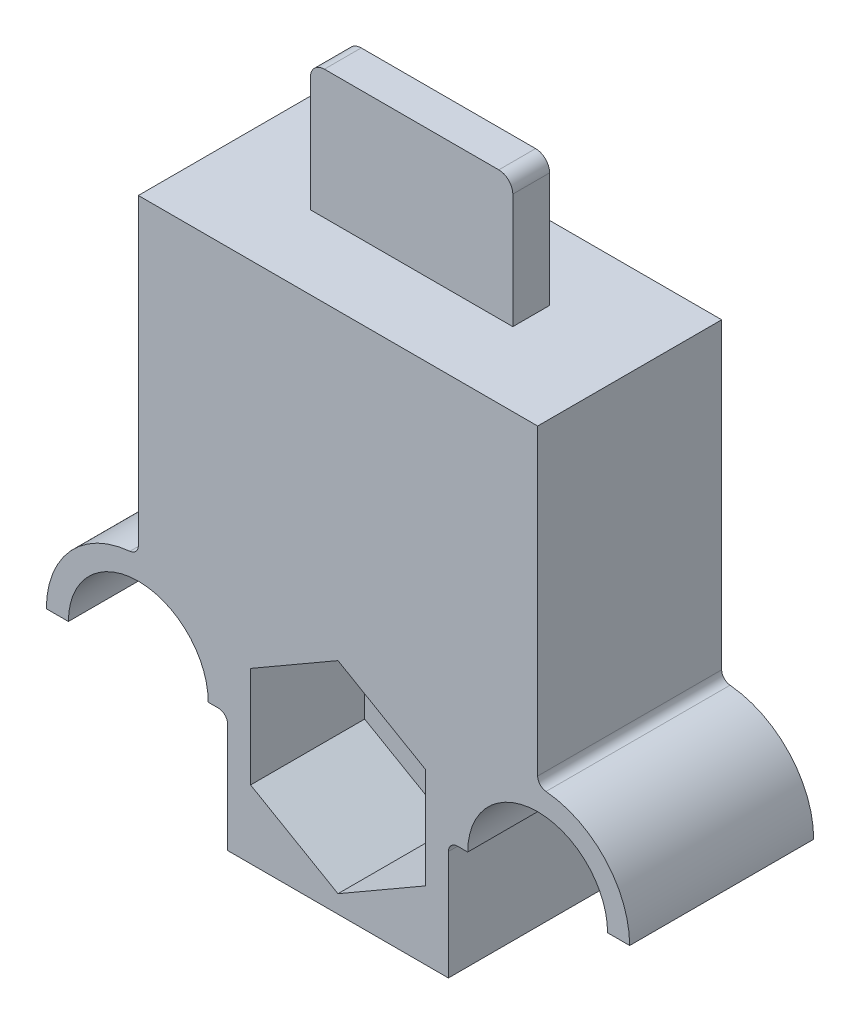
ISO-10303-21;
HEADER;
FILE_DESCRIPTION(('STEP AP214'),'2;1');
FILE_NAME('part.step','',(''),(''),'','','');
FILE_SCHEMA(('AUTOMOTIVE_DESIGN { 1 0 10303 214 1 1 1 1 }'));
ENDSEC;
DATA;
#1=APPLICATION_CONTEXT('core data for automotive mechanical design processes');
#2=APPLICATION_PROTOCOL_DEFINITION('international standard','automotive_design',2000,#1);
#3=PRODUCT_CONTEXT('',#1,'mechanical');
#4=PRODUCT('Part','Part','',(#3));
#5=PRODUCT_RELATED_PRODUCT_CATEGORY('part','',(#4));
#6=PRODUCT_DEFINITION_FORMATION('','',#4);
#7=PRODUCT_DEFINITION_CONTEXT('part definition',#1,'design');
#8=PRODUCT_DEFINITION('design','',#6,#7);
#9=PRODUCT_DEFINITION_SHAPE('','',#8);
#10=(LENGTH_UNIT() NAMED_UNIT(*) SI_UNIT(.MILLI.,.METRE.));
#11=(NAMED_UNIT(*) PLANE_ANGLE_UNIT() SI_UNIT($,.RADIAN.));
#12=(NAMED_UNIT(*) SI_UNIT($,.STERADIAN.) SOLID_ANGLE_UNIT());
#13=UNCERTAINTY_MEASURE_WITH_UNIT(LENGTH_MEASURE(1.E-05),#10,'distance_accuracy_value','');
#14=(GEOMETRIC_REPRESENTATION_CONTEXT(3) GLOBAL_UNCERTAINTY_ASSIGNED_CONTEXT((#13)) GLOBAL_UNIT_ASSIGNED_CONTEXT((#10,
#11,#12)) REPRESENTATION_CONTEXT('',''));
#15=CARTESIAN_POINT('',(0.,0.,0.));
#16=DIRECTION('',(0.,0.,1.));
#17=DIRECTION('',(1.,0.,0.));
#18=AXIS2_PLACEMENT_3D('',#15,#16,#17);
#19=CARTESIAN_POINT('',(9.15,1.95,-3828.45170901728));
#20=DIRECTION('',(0.,-1.,0.));
#21=DIRECTION('',(0.,0.,-1.));
#22=AXIS2_PLACEMENT_3D('',#19,#20,#21);
#23=PLANE('',#22);
#24=DIRECTION('',(-1.,0.,0.));
#25=VECTOR('',#24,1.);
#26=CARTESIAN_POINT('',(9.15,1.95,-3838.45170901728));
#27=LINE('',#26,#25);
#28=CARTESIAN_POINT('',(30.85,1.95,-3838.45170901728));
#29=VERTEX_POINT('',#28);
#30=CARTESIAN_POINT('',(9.15,1.95,-3838.45170901728));
#31=VERTEX_POINT('',#30);
#32=EDGE_CURVE('E362',#29,#31,#27,.T.);
#33=ORIENTED_EDGE('',*,*,#32,.T.);
#34=DIRECTION('',(0.,0.,-1.));
#35=VECTOR('',#34,1.);
#36=CARTESIAN_POINT('',(9.15,1.95,-3828.45170901728));
#37=LINE('',#36,#35);
#38=CARTESIAN_POINT('',(9.15,1.95,-3828.45170901728));
#39=VERTEX_POINT('',#38);
#40=EDGE_CURVE('E440',#39,#31,#37,.T.);
#41=ORIENTED_EDGE('',*,*,#40,.F.);
#42=DIRECTION('',(-1.,0.,0.));
#43=VECTOR('',#42,1.);
#44=CARTESIAN_POINT('',(9.15,1.95,-3828.45170901728));
#45=LINE('',#44,#43);
#46=CARTESIAN_POINT('',(30.85,1.95,-3828.45170901728));
#47=VERTEX_POINT('',#46);
#48=EDGE_CURVE('E322',#47,#39,#45,.T.);
#49=ORIENTED_EDGE('',*,*,#48,.F.);
#50=DIRECTION('',(0.,0.,-1.));
#51=VECTOR('',#50,1.);
#52=CARTESIAN_POINT('',(30.85,1.95,-3828.45170901728));
#53=LINE('',#52,#51);
#54=EDGE_CURVE('E438',#47,#29,#53,.T.);
#55=ORIENTED_EDGE('',*,*,#54,.T.);
#56=EDGE_LOOP('',(#33,#41,#49,#55));
#57=FACE_BOUND('',#56,.T.);
#58=DIRECTION('',(0.,0.,-1.));
#59=VECTOR('',#58,1.);
#60=CARTESIAN_POINT('',(25.5,1.95,-3832.45170901728));
#61=LINE('',#60,#59);
#62=CARTESIAN_POINT('',(25.5,1.95,-3832.45170901728));
#63=VERTEX_POINT('',#62);
#64=CARTESIAN_POINT('',(25.5,1.95,-3834.45170901728));
#65=VERTEX_POINT('',#64);
#66=EDGE_CURVE('E252',#63,#65,#61,.T.);
#67=ORIENTED_EDGE('',*,*,#66,.F.);
#68=DIRECTION('',(1.,0.,0.));
#69=VECTOR('',#68,1.);
#70=CARTESIAN_POINT('',(25.5,1.95,-3832.45170901728));
#71=LINE('',#70,#69);
#72=CARTESIAN_POINT('',(14.5,1.95,-3832.45170901728));
#73=VERTEX_POINT('',#72);
#74=EDGE_CURVE('E249',#73,#63,#71,.T.);
#75=ORIENTED_EDGE('',*,*,#74,.F.);
#76=DIRECTION('',(0.,0.,1.));
#77=VECTOR('',#76,1.);
#78=CARTESIAN_POINT('',(14.5,1.95,-3832.45170901728));
#79=LINE('',#78,#77);
#80=CARTESIAN_POINT('',(14.5,1.95,-3834.45170901728));
#81=VERTEX_POINT('',#80);
#82=EDGE_CURVE('E240',#81,#73,#79,.T.);
#83=ORIENTED_EDGE('',*,*,#82,.F.);
#84=DIRECTION('',(-1.,0.,0.));
#85=VECTOR('',#84,1.);
#86=CARTESIAN_POINT('',(25.5,1.95,-3834.45170901728));
#87=LINE('',#86,#85);
#88=EDGE_CURVE('E250',#65,#81,#87,.T.);
#89=ORIENTED_EDGE('',*,*,#88,.F.);
#90=EDGE_LOOP('',(#67,#75,#83,#89));
#91=FACE_BOUND('',#90,.T.);
#92=ADVANCED_FACE('F39',(#57,#91),#23,.F.);
#93=CARTESIAN_POINT('',(20.,-20.,-3828.45170901728));
#94=DIRECTION('',(0.,0.,-1.));
#95=DIRECTION('',(-1.,0.,0.));
#96=AXIS2_PLACEMENT_3D('',#93,#94,#95);
#97=CYLINDRICAL_SURFACE('',#96,2.5);
#98=CARTESIAN_POINT('',(20.,-20.,-3838.45170901728));
#99=DIRECTION('',(0.,0.,1.));
#100=DIRECTION('',(1.,0.,0.));
#101=AXIS2_PLACEMENT_3D('',#98,#99,#100);
#102=CIRCLE('',#101,2.5);
#103=CARTESIAN_POINT('',(22.5,-20.,-3838.45170901728));
#104=VERTEX_POINT('',#103);
#105=EDGE_CURVE('E311',#104,#104,#102,.T.);
#106=ORIENTED_EDGE('',*,*,#105,.F.);
#107=EDGE_LOOP('',(#106));
#108=FACE_BOUND('',#107,.T.);
#109=CARTESIAN_POINT('',(20.,-20.,-3834.65170901728));
#110=DIRECTION('',(0.,0.,1.));
#111=DIRECTION('',(1.,0.,0.));
#112=AXIS2_PLACEMENT_3D('',#109,#110,#111);
#113=CIRCLE('',#112,2.5);
#114=CARTESIAN_POINT('',(22.5,-20.,-3834.65170901728));
#115=VERTEX_POINT('',#114);
#116=EDGE_CURVE('E302',#115,#115,#113,.T.);
#117=ORIENTED_EDGE('',*,*,#116,.T.);
#118=EDGE_LOOP('',(#117));
#119=FACE_BOUND('',#118,.T.);
#120=ADVANCED_FACE('F489',(#108,#119),#97,.F.);
#121=CARTESIAN_POINT('',(31.35,-14.5227744249483,-3828.45170901728));
#122=DIRECTION('',(0.,0.,-1.));
#123=DIRECTION('',(-1.,0.,0.));
#124=AXIS2_PLACEMENT_3D('',#121,#122,#123);
#125=PLANE('',#124);
#126=DIRECTION('',(0.866025403784439,0.5,0.));
#127=VECTOR('',#126,1.);
#128=CARTESIAN_POINT('',(20.,-25.4848275573014,-3828.45170901728));
#129=LINE('',#128,#127);
#130=CARTESIAN_POINT('',(20.,-25.4848275573014,-3828.45170901728));
#131=VERTEX_POINT('',#130);
#132=CARTESIAN_POINT('',(24.75,-22.7424137786507,-3828.45170901728));
#133=VERTEX_POINT('',#132);
#134=EDGE_CURVE('E290',#131,#133,#129,.T.);
#135=ORIENTED_EDGE('',*,*,#134,.F.);
#136=DIRECTION('',(0.866025403784439,-0.5,0.));
#137=VECTOR('',#136,1.);
#138=CARTESIAN_POINT('',(15.25,-22.7424137786507,-3828.45170901728));
#139=LINE('',#138,#137);
#140=CARTESIAN_POINT('',(15.25,-22.7424137786507,-3828.45170901728));
#141=VERTEX_POINT('',#140);
#142=EDGE_CURVE('E262',#141,#131,#139,.T.);
#143=ORIENTED_EDGE('',*,*,#142,.F.);
#144=DIRECTION('',(0.,-1.,0.));
#145=VECTOR('',#144,1.);
#146=CARTESIAN_POINT('',(15.25,-17.2575862213493,-3828.45170901728));
#147=LINE('',#146,#145);
#148=CARTESIAN_POINT('',(15.25,-17.2575862213493,-3828.45170901728));
#149=VERTEX_POINT('',#148);
#150=EDGE_CURVE('E269',#149,#141,#147,.T.);
#151=ORIENTED_EDGE('',*,*,#150,.F.);
#152=DIRECTION('',(-0.866025403784439,-0.5,0.));
#153=VECTOR('',#152,1.);
#154=CARTESIAN_POINT('',(20.,-14.5151724426986,-3828.45170901728));
#155=LINE('',#154,#153);
#156=CARTESIAN_POINT('',(20.,-14.5151724426986,-3828.45170901728));
#157=VERTEX_POINT('',#156);
#158=EDGE_CURVE('E298',#157,#149,#155,.T.);
#159=ORIENTED_EDGE('',*,*,#158,.F.);
#160=DIRECTION('',(-0.866025403784439,0.5,0.));
#161=VECTOR('',#160,1.);
#162=CARTESIAN_POINT('',(24.75,-17.2575862213493,-3828.45170901728));
#163=LINE('',#162,#161);
#164=CARTESIAN_POINT('',(24.75,-17.2575862213493,-3828.45170901728));
#165=VERTEX_POINT('',#164);
#166=EDGE_CURVE('E292',#165,#157,#163,.T.);
#167=ORIENTED_EDGE('',*,*,#166,.F.);
#168=DIRECTION('',(0.,1.,0.));
#169=VECTOR('',#168,1.);
#170=CARTESIAN_POINT('',(24.75,-22.7424137786507,-3828.45170901728));
#171=LINE('',#170,#169);
#172=EDGE_CURVE('E288',#133,#165,#171,.T.);
#173=ORIENTED_EDGE('',*,*,#172,.F.);
#174=EDGE_LOOP('',(#135,#143,#151,#159,#167,#173));
#175=FACE_BOUND('',#174,.T.);
#176=CARTESIAN_POINT('',(31.35,-14.5227744249483,-3828.45170901728));
#177=DIRECTION('',(0.,0.,-1.));
#178=DIRECTION('',(-1.,0.,0.));
#179=AXIS2_PLACEMENT_3D('',#176,#177,#178);
#180=CIRCLE('',#179,0.499999999999999);
#181=CARTESIAN_POINT('',(31.3045454545455,-15.0207040226803,-3828.45170901728));
#182=VERTEX_POINT('',#181);
#183=CARTESIAN_POINT('',(30.85,-14.5227744249483,-3828.45170901728));
#184=VERTEX_POINT('',#183);
#185=EDGE_CURVE('E317',#182,#184,#180,.T.);
#186=ORIENTED_EDGE('',*,*,#185,.T.);
#187=DIRECTION('',(0.,1.,0.));
#188=VECTOR('',#187,1.);
#189=CARTESIAN_POINT('',(30.85,1.95,-3828.45170901728));
#190=LINE('',#189,#188);
#191=EDGE_CURVE('E323',#184,#47,#190,.T.);
#192=ORIENTED_EDGE('',*,*,#191,.T.);
#193=ORIENTED_EDGE('',*,*,#48,.T.);
#194=DIRECTION('',(0.,-1.,0.));
#195=VECTOR('',#194,1.);
#196=CARTESIAN_POINT('',(9.15,-14.5227744249483,-3828.45170901728));
#197=LINE('',#196,#195);
#198=CARTESIAN_POINT('',(9.15,-14.5227744249483,-3828.45170901728));
#199=VERTEX_POINT('',#198);
#200=EDGE_CURVE('E328',#39,#199,#197,.T.);
#201=ORIENTED_EDGE('',*,*,#200,.T.);
#202=CARTESIAN_POINT('',(8.65,-14.5227744249483,-3828.45170901728));
#203=DIRECTION('',(0.,0.,-1.));
#204=DIRECTION('',(1.,0.,0.));
#205=AXIS2_PLACEMENT_3D('',#202,#203,#204);
#206=CIRCLE('',#205,0.5);
#207=CARTESIAN_POINT('',(8.69545454545454,-15.0207040226803,-3828.45170901728));
#208=VERTEX_POINT('',#207);
#209=EDGE_CURVE('E327',#199,#208,#206,.T.);
#210=ORIENTED_EDGE('',*,*,#209,.T.);
#211=CARTESIAN_POINT('',(9.15,-20.,-3828.45170901728));
#212=DIRECTION('',(0.,0.,1.));
#213=DIRECTION('',(1.,0.,0.));
#214=AXIS2_PLACEMENT_3D('',#211,#212,#213);
#215=CIRCLE('',#214,5.);
#216=CARTESIAN_POINT('',(4.15,-20.,-3828.45170901728));
#217=VERTEX_POINT('',#216);
#218=EDGE_CURVE('E326',#208,#217,#215,.T.);
#219=ORIENTED_EDGE('',*,*,#218,.T.);
#220=DIRECTION('',(1.,0.,0.));
#221=VECTOR('',#220,1.);
#222=CARTESIAN_POINT('',(5.35,-20.,-3828.45170901728));
#223=LINE('',#222,#221);
#224=CARTESIAN_POINT('',(5.35,-20.,-3828.45170901728));
#225=VERTEX_POINT('',#224);
#226=EDGE_CURVE('E332',#217,#225,#223,.T.);
#227=ORIENTED_EDGE('',*,*,#226,.T.);
#228=CARTESIAN_POINT('',(9.15,-20.,-3828.45170901728));
#229=DIRECTION('',(0.,0.,-1.));
#230=DIRECTION('',(1.,0.,0.));
#231=AXIS2_PLACEMENT_3D('',#228,#229,#230);
#232=CIRCLE('',#231,3.8);
#233=CARTESIAN_POINT('',(12.95,-20.,-3828.45170901728));
#234=VERTEX_POINT('',#233);
#235=EDGE_CURVE('E335',#225,#234,#232,.T.);
#236=ORIENTED_EDGE('',*,*,#235,.T.);
#237=DIRECTION('',(1.,0.,0.));
#238=VECTOR('',#237,1.);
#239=CARTESIAN_POINT('',(13.5,-20.,-3828.45170901728));
#240=LINE('',#239,#238);
#241=CARTESIAN_POINT('',(13.5,-20.,-3828.45170901728));
#242=VERTEX_POINT('',#241);
#243=EDGE_CURVE('E338',#234,#242,#240,.T.);
#244=ORIENTED_EDGE('',*,*,#243,.T.);
#245=CARTESIAN_POINT('',(13.5,-20.5,-3828.45170901728));
#246=DIRECTION('',(0.,0.,-1.));
#247=DIRECTION('',(-1.,0.,0.));
#248=AXIS2_PLACEMENT_3D('',#245,#246,#247);
#249=CIRCLE('',#248,0.5);
#250=CARTESIAN_POINT('',(14.,-20.5,-3828.45170901728));
#251=VERTEX_POINT('',#250);
#252=EDGE_CURVE('E336',#242,#251,#249,.T.);
#253=ORIENTED_EDGE('',*,*,#252,.T.);
#254=DIRECTION('',(0.,-1.,0.));
#255=VECTOR('',#254,1.);
#256=CARTESIAN_POINT('',(14.,-26.4525430578741,-3828.45170901728));
#257=LINE('',#256,#255);
#258=CARTESIAN_POINT('',(14.,-26.4525430578741,-3828.45170901728));
#259=VERTEX_POINT('',#258);
#260=EDGE_CURVE('E337',#251,#259,#257,.T.);
#261=ORIENTED_EDGE('',*,*,#260,.T.);
#262=DIRECTION('',(1.,0.,0.));
#263=VECTOR('',#262,1.);
#264=CARTESIAN_POINT('',(20.,-26.4525430578741,-3828.45170901728));
#265=LINE('',#264,#263);
#266=CARTESIAN_POINT('',(26.,-26.4525430578741,-3828.45170901728));
#267=VERTEX_POINT('',#266);
#268=EDGE_CURVE('E345',#259,#267,#265,.T.);
#269=ORIENTED_EDGE('',*,*,#268,.T.);
#270=DIRECTION('',(0.,1.,0.));
#271=VECTOR('',#270,1.);
#272=CARTESIAN_POINT('',(26.,-26.4525430578741,-3828.45170901728));
#273=LINE('',#272,#271);
#274=CARTESIAN_POINT('',(26.,-20.5,-3828.45170901728));
#275=VERTEX_POINT('',#274);
#276=EDGE_CURVE('E342',#267,#275,#273,.T.);
#277=ORIENTED_EDGE('',*,*,#276,.T.);
#278=CARTESIAN_POINT('',(26.5,-20.5,-3828.45170901728));
#279=DIRECTION('',(0.,0.,-1.));
#280=DIRECTION('',(1.,0.,0.));
#281=AXIS2_PLACEMENT_3D('',#278,#279,#280);
#282=CIRCLE('',#281,0.5);
#283=CARTESIAN_POINT('',(26.5,-20.,-3828.45170901728));
#284=VERTEX_POINT('',#283);
#285=EDGE_CURVE('E346',#275,#284,#282,.T.);
#286=ORIENTED_EDGE('',*,*,#285,.T.);
#287=DIRECTION('',(1.,0.,0.));
#288=VECTOR('',#287,1.);
#289=CARTESIAN_POINT('',(27.05,-20.,-3828.45170901728));
#290=LINE('',#289,#288);
#291=CARTESIAN_POINT('',(27.05,-20.,-3828.45170901728));
#292=VERTEX_POINT('',#291);
#293=EDGE_CURVE('E348',#284,#292,#290,.T.);
#294=ORIENTED_EDGE('',*,*,#293,.T.);
#295=CARTESIAN_POINT('',(30.85,-20.,-3828.45170901728));
#296=DIRECTION('',(0.,0.,-1.));
#297=DIRECTION('',(1.,0.,0.));
#298=AXIS2_PLACEMENT_3D('',#295,#296,#297);
#299=CIRCLE('',#298,3.8);
#300=CARTESIAN_POINT('',(34.65,-20.,-3828.45170901728));
#301=VERTEX_POINT('',#300);
#302=EDGE_CURVE('E349',#292,#301,#299,.T.);
#303=ORIENTED_EDGE('',*,*,#302,.T.);
#304=DIRECTION('',(1.,0.,0.));
#305=VECTOR('',#304,1.);
#306=CARTESIAN_POINT('',(34.65,-20.,-3828.45170901728));
#307=LINE('',#306,#305);
#308=CARTESIAN_POINT('',(35.85,-20.,-3828.45170901728));
#309=VERTEX_POINT('',#308);
#310=EDGE_CURVE('E355',#301,#309,#307,.T.);
#311=ORIENTED_EDGE('',*,*,#310,.T.);
#312=CARTESIAN_POINT('',(30.85,-20.,-3828.45170901728));
#313=DIRECTION('',(0.,0.,1.));
#314=DIRECTION('',(1.,0.,0.));
#315=AXIS2_PLACEMENT_3D('',#312,#313,#314);
#316=CIRCLE('',#315,5.);
#317=EDGE_CURVE('E353',#309,#182,#316,.T.);
#318=ORIENTED_EDGE('',*,*,#317,.T.);
#319=EDGE_LOOP('',(#186,#192,#193,#201,#210,#219,#227,#236,#244,#253,#261,#269,#277,#286,#294,
#303,#311,#318));
#320=FACE_BOUND('',#319,.T.);
#321=ADVANCED_FACE('F494',(#175,#320),#125,.F.);
#322=CARTESIAN_POINT('',(31.35,-14.5227744249483,-3838.45170901728));
#323=DIRECTION('',(0.,0.,-1.));
#324=DIRECTION('',(-1.,0.,0.));
#325=AXIS2_PLACEMENT_3D('',#322,#323,#324);
#326=PLANE('',#325);
#327=CARTESIAN_POINT('',(31.35,-14.5227744249483,-3838.45170901728));
#328=DIRECTION('',(0.,0.,-1.));
#329=DIRECTION('',(-1.,0.,0.));
#330=AXIS2_PLACEMENT_3D('',#327,#328,#329);
#331=CIRCLE('',#330,0.499999999999999);
#332=CARTESIAN_POINT('',(31.3045454545455,-15.0207040226803,-3838.45170901728));
#333=VERTEX_POINT('',#332);
#334=CARTESIAN_POINT('',(30.85,-14.5227744249483,-3838.45170901728));
#335=VERTEX_POINT('',#334);
#336=EDGE_CURVE('E320',#333,#335,#331,.T.);
#337=ORIENTED_EDGE('',*,*,#336,.F.);
#338=CARTESIAN_POINT('',(30.85,-20.,-3838.45170901728));
#339=DIRECTION('',(0.,0.,1.));
#340=DIRECTION('',(1.,0.,0.));
#341=AXIS2_PLACEMENT_3D('',#338,#339,#340);
#342=CIRCLE('',#341,5.);
#343=CARTESIAN_POINT('',(35.85,-20.,-3838.45170901728));
#344=VERTEX_POINT('',#343);
#345=EDGE_CURVE('E325',#344,#333,#342,.T.);
#346=ORIENTED_EDGE('',*,*,#345,.F.);
#347=DIRECTION('',(1.,0.,0.));
#348=VECTOR('',#347,1.);
#349=CARTESIAN_POINT('',(34.65,-20.,-3838.45170901728));
#350=LINE('',#349,#348);
#351=CARTESIAN_POINT('',(34.65,-20.,-3838.45170901728));
#352=VERTEX_POINT('',#351);
#353=EDGE_CURVE('E388',#352,#344,#350,.T.);
#354=ORIENTED_EDGE('',*,*,#353,.F.);
#355=CARTESIAN_POINT('',(30.85,-20.,-3838.45170901728));
#356=DIRECTION('',(0.,0.,-1.));
#357=DIRECTION('',(1.,0.,0.));
#358=AXIS2_PLACEMENT_3D('',#355,#356,#357);
#359=CIRCLE('',#358,3.8);
#360=CARTESIAN_POINT('',(27.05,-20.,-3838.45170901728));
#361=VERTEX_POINT('',#360);
#362=EDGE_CURVE('E389',#361,#352,#359,.T.);
#363=ORIENTED_EDGE('',*,*,#362,.F.);
#364=DIRECTION('',(1.,0.,0.));
#365=VECTOR('',#364,1.);
#366=CARTESIAN_POINT('',(27.05,-20.,-3838.45170901728));
#367=LINE('',#366,#365);
#368=CARTESIAN_POINT('',(26.5,-20.,-3838.45170901728));
#369=VERTEX_POINT('',#368);
#370=EDGE_CURVE('E387',#369,#361,#367,.T.);
#371=ORIENTED_EDGE('',*,*,#370,.F.);
#372=CARTESIAN_POINT('',(26.5,-20.5,-3838.45170901728));
#373=DIRECTION('',(0.,0.,-1.));
#374=DIRECTION('',(1.,0.,0.));
#375=AXIS2_PLACEMENT_3D('',#372,#373,#374);
#376=CIRCLE('',#375,0.5);
#377=CARTESIAN_POINT('',(26.,-20.5,-3838.45170901728));
#378=VERTEX_POINT('',#377);
#379=EDGE_CURVE('E384',#378,#369,#376,.T.);
#380=ORIENTED_EDGE('',*,*,#379,.F.);
#381=DIRECTION('',(0.,1.,0.));
#382=VECTOR('',#381,1.);
#383=CARTESIAN_POINT('',(26.,-26.4525430578741,-3838.45170901728));
#384=LINE('',#383,#382);
#385=CARTESIAN_POINT('',(26.,-26.4525430578741,-3838.45170901728));
#386=VERTEX_POINT('',#385);
#387=EDGE_CURVE('E385',#386,#378,#384,.T.);
#388=ORIENTED_EDGE('',*,*,#387,.F.);
#389=DIRECTION('',(1.,0.,0.));
#390=VECTOR('',#389,1.);
#391=CARTESIAN_POINT('',(20.,-26.4525430578741,-3838.45170901728));
#392=LINE('',#391,#390);
#393=CARTESIAN_POINT('',(14.,-26.4525430578741,-3838.45170901728));
#394=VERTEX_POINT('',#393);
#395=EDGE_CURVE('E376',#394,#386,#392,.T.);
#396=ORIENTED_EDGE('',*,*,#395,.F.);
#397=DIRECTION('',(0.,-1.,0.));
#398=VECTOR('',#397,1.);
#399=CARTESIAN_POINT('',(14.,-26.4525430578741,-3838.45170901728));
#400=LINE('',#399,#398);
#401=CARTESIAN_POINT('',(14.,-20.5,-3838.45170901728));
#402=VERTEX_POINT('',#401);
#403=EDGE_CURVE('E379',#402,#394,#400,.T.);
#404=ORIENTED_EDGE('',*,*,#403,.F.);
#405=CARTESIAN_POINT('',(13.5,-20.5,-3838.45170901728));
#406=DIRECTION('',(0.,0.,-1.));
#407=DIRECTION('',(-1.,0.,0.));
#408=AXIS2_PLACEMENT_3D('',#405,#406,#407);
#409=CIRCLE('',#408,0.5);
#410=CARTESIAN_POINT('',(13.5,-20.,-3838.45170901728));
#411=VERTEX_POINT('',#410);
#412=EDGE_CURVE('E374',#411,#402,#409,.T.);
#413=ORIENTED_EDGE('',*,*,#412,.F.);
#414=DIRECTION('',(1.,0.,0.));
#415=VECTOR('',#414,1.);
#416=CARTESIAN_POINT('',(13.5,-20.,-3838.45170901728));
#417=LINE('',#416,#415);
#418=CARTESIAN_POINT('',(12.95,-20.,-3838.45170901728));
#419=VERTEX_POINT('',#418);
#420=EDGE_CURVE('E371',#419,#411,#417,.T.);
#421=ORIENTED_EDGE('',*,*,#420,.F.);
#422=CARTESIAN_POINT('',(9.15,-20.,-3838.45170901728));
#423=DIRECTION('',(0.,0.,-1.));
#424=DIRECTION('',(1.,0.,0.));
#425=AXIS2_PLACEMENT_3D('',#422,#423,#424);
#426=CIRCLE('',#425,3.8);
#427=CARTESIAN_POINT('',(5.35,-20.,-3838.45170901728));
#428=VERTEX_POINT('',#427);
#429=EDGE_CURVE('E373',#428,#419,#426,.T.);
#430=ORIENTED_EDGE('',*,*,#429,.F.);
#431=DIRECTION('',(1.,0.,0.));
#432=VECTOR('',#431,1.);
#433=CARTESIAN_POINT('',(5.35,-20.,-3838.45170901728));
#434=LINE('',#433,#432);
#435=CARTESIAN_POINT('',(4.15,-20.,-3838.45170901728));
#436=VERTEX_POINT('',#435);
#437=EDGE_CURVE('E368',#436,#428,#434,.T.);
#438=ORIENTED_EDGE('',*,*,#437,.F.);
#439=CARTESIAN_POINT('',(9.15,-20.,-3838.45170901728));
#440=DIRECTION('',(0.,0.,1.));
#441=DIRECTION('',(1.,0.,0.));
#442=AXIS2_PLACEMENT_3D('',#439,#440,#441);
#443=CIRCLE('',#442,5.);
#444=CARTESIAN_POINT('',(8.69545454545454,-15.0207040226803,-3838.45170901728));
#445=VERTEX_POINT('',#444);
#446=EDGE_CURVE('E370',#445,#436,#443,.T.);
#447=ORIENTED_EDGE('',*,*,#446,.F.);
#448=CARTESIAN_POINT('',(8.65,-14.5227744249483,-3838.45170901728));
#449=DIRECTION('',(0.,0.,-1.));
#450=DIRECTION('',(1.,0.,0.));
#451=AXIS2_PLACEMENT_3D('',#448,#449,#450);
#452=CIRCLE('',#451,0.5);
#453=CARTESIAN_POINT('',(9.15,-14.5227744249483,-3838.45170901728));
#454=VERTEX_POINT('',#453);
#455=EDGE_CURVE('E363',#454,#445,#452,.T.);
#456=ORIENTED_EDGE('',*,*,#455,.F.);
#457=DIRECTION('',(0.,-1.,0.));
#458=VECTOR('',#457,1.);
#459=CARTESIAN_POINT('',(9.15,-14.5227744249483,-3838.45170901728));
#460=LINE('',#459,#458);
#461=EDGE_CURVE('E364',#31,#454,#460,.T.);
#462=ORIENTED_EDGE('',*,*,#461,.F.);
#463=ORIENTED_EDGE('',*,*,#32,.F.);
#464=DIRECTION('',(0.,1.,0.));
#465=VECTOR('',#464,1.);
#466=CARTESIAN_POINT('',(30.85,1.95,-3838.45170901728));
#467=LINE('',#466,#465);
#468=EDGE_CURVE('E356',#335,#29,#467,.T.);
#469=ORIENTED_EDGE('',*,*,#468,.F.);
#470=EDGE_LOOP('',(#337,#346,#354,#363,#371,#380,#388,#396,#404,#413,#421,#430,#438,#447,#456,
#462,#463,#469));
#471=FACE_BOUND('',#470,.T.);
#472=ORIENTED_EDGE('',*,*,#105,.T.);
#473=EDGE_LOOP('',(#472));
#474=FACE_BOUND('',#473,.T.);
#475=ADVANCED_FACE('F509',(#471,#474),#326,.T.);
#476=CARTESIAN_POINT('',(31.35,-14.5227744249483,-3828.45170901728));
#477=DIRECTION('',(0.,0.,-1.));
#478=DIRECTION('',(-1.,0.,0.));
#479=AXIS2_PLACEMENT_3D('',#476,#477,#478);
#480=CYLINDRICAL_SURFACE('',#479,0.499999999999999);
#481=ORIENTED_EDGE('',*,*,#336,.T.);
#482=DIRECTION('',(0.,0.,-1.));
#483=VECTOR('',#482,1.);
#484=CARTESIAN_POINT('',(30.85,-14.5227744249483,-3828.45170901728));
#485=LINE('',#484,#483);
#486=EDGE_CURVE('E442',#184,#335,#485,.T.);
#487=ORIENTED_EDGE('',*,*,#486,.F.);
#488=ORIENTED_EDGE('',*,*,#185,.F.);
#489=DIRECTION('',(0.,0.,-1.));
#490=VECTOR('',#489,1.);
#491=CARTESIAN_POINT('',(31.3045454545455,-15.0207040226803,-3828.45170901728));
#492=LINE('',#491,#490);
#493=EDGE_CURVE('E357',#182,#333,#492,.T.);
#494=ORIENTED_EDGE('',*,*,#493,.T.);
#495=EDGE_LOOP('',(#481,#487,#488,#494));
#496=FACE_BOUND('',#495,.T.);
#497=ADVANCED_FACE('F504',(#496),#480,.F.);
#498=CARTESIAN_POINT('',(30.85,1.95,-3828.45170901728));
#499=DIRECTION('',(-1.,0.,0.));
#500=DIRECTION('',(0.,-1.,0.));
#501=AXIS2_PLACEMENT_3D('',#498,#499,#500);
#502=PLANE('',#501);
#503=ORIENTED_EDGE('',*,*,#468,.T.);
#504=ORIENTED_EDGE('',*,*,#54,.F.);
#505=ORIENTED_EDGE('',*,*,#191,.F.);
#506=ORIENTED_EDGE('',*,*,#486,.T.);
#507=EDGE_LOOP('',(#503,#504,#505,#506));
#508=FACE_BOUND('',#507,.T.);
#509=ADVANCED_FACE('F505',(#508),#502,.F.);
#510=CARTESIAN_POINT('',(9.15,-14.5227744249483,-3828.45170901728));
#511=DIRECTION('',(1.,0.,0.));
#512=DIRECTION('',(0.,1.,0.));
#513=AXIS2_PLACEMENT_3D('',#510,#511,#512);
#514=PLANE('',#513);
#515=ORIENTED_EDGE('',*,*,#461,.T.);
#516=DIRECTION('',(0.,0.,-1.));
#517=VECTOR('',#516,1.);
#518=CARTESIAN_POINT('',(9.15,-14.5227744249483,-3828.45170901728));
#519=LINE('',#518,#517);
#520=EDGE_CURVE('E431',#199,#454,#519,.T.);
#521=ORIENTED_EDGE('',*,*,#520,.F.);
#522=ORIENTED_EDGE('',*,*,#200,.F.);
#523=ORIENTED_EDGE('',*,*,#40,.T.);
#524=EDGE_LOOP('',(#515,#521,#522,#523));
#525=FACE_BOUND('',#524,.T.);
#526=ADVANCED_FACE('F499',(#525),#514,.F.);
#527=CARTESIAN_POINT('',(8.65,-14.5227744249483,-3828.45170901728));
#528=DIRECTION('',(0.,0.,-1.));
#529=DIRECTION('',(-1.,0.,0.));
#530=AXIS2_PLACEMENT_3D('',#527,#528,#529);
#531=CYLINDRICAL_SURFACE('',#530,0.5);
#532=ORIENTED_EDGE('',*,*,#455,.T.);
#533=DIRECTION('',(0.,0.,-1.));
#534=VECTOR('',#533,1.);
#535=CARTESIAN_POINT('',(8.69545454545454,-15.0207040226803,-3828.45170901728));
#536=LINE('',#535,#534);
#537=EDGE_CURVE('E432',#208,#445,#536,.T.);
#538=ORIENTED_EDGE('',*,*,#537,.F.);
#539=ORIENTED_EDGE('',*,*,#209,.F.);
#540=ORIENTED_EDGE('',*,*,#520,.T.);
#541=EDGE_LOOP('',(#532,#538,#539,#540));
#542=FACE_BOUND('',#541,.T.);
#543=ADVANCED_FACE('F745',(#542),#531,.F.);
#544=CARTESIAN_POINT('',(9.15,-20.,-3828.45170901728));
#545=DIRECTION('',(0.,0.,-1.));
#546=DIRECTION('',(-1.,0.,0.));
#547=AXIS2_PLACEMENT_3D('',#544,#545,#546);
#548=CYLINDRICAL_SURFACE('',#547,5.);
#549=ORIENTED_EDGE('',*,*,#446,.T.);
#550=DIRECTION('',(0.,0.,-1.));
#551=VECTOR('',#550,1.);
#552=CARTESIAN_POINT('',(4.15,-20.,-3828.45170901728));
#553=LINE('',#552,#551);
#554=EDGE_CURVE('E427',#217,#436,#553,.T.);
#555=ORIENTED_EDGE('',*,*,#554,.F.);
#556=ORIENTED_EDGE('',*,*,#218,.F.);
#557=ORIENTED_EDGE('',*,*,#537,.T.);
#558=EDGE_LOOP('',(#549,#555,#556,#557));
#559=FACE_BOUND('',#558,.T.);
#560=ADVANCED_FACE('F734',(#559),#548,.T.);
#561=CARTESIAN_POINT('',(5.35,-20.,-3828.45170901728));
#562=DIRECTION('',(0.,1.,0.));
#563=DIRECTION('',(0.,0.,1.));
#564=AXIS2_PLACEMENT_3D('',#561,#562,#563);
#565=PLANE('',#564);
#566=ORIENTED_EDGE('',*,*,#437,.T.);
#567=DIRECTION('',(0.,0.,-1.));
#568=VECTOR('',#567,1.);
#569=CARTESIAN_POINT('',(5.35,-20.,-3828.45170901728));
#570=LINE('',#569,#568);
#571=EDGE_CURVE('E424',#225,#428,#570,.T.);
#572=ORIENTED_EDGE('',*,*,#571,.F.);
#573=ORIENTED_EDGE('',*,*,#226,.F.);
#574=ORIENTED_EDGE('',*,*,#554,.T.);
#575=EDGE_LOOP('',(#566,#572,#573,#574));
#576=FACE_BOUND('',#575,.T.);
#577=ADVANCED_FACE('F722',(#576),#565,.F.);
#578=CARTESIAN_POINT('',(9.15,-20.,-3828.45170901728));
#579=DIRECTION('',(0.,0.,-1.));
#580=DIRECTION('',(-1.,0.,0.));
#581=AXIS2_PLACEMENT_3D('',#578,#579,#580);
#582=CYLINDRICAL_SURFACE('',#581,3.8);
#583=ORIENTED_EDGE('',*,*,#429,.T.);
#584=DIRECTION('',(0.,0.,-1.));
#585=VECTOR('',#584,1.);
#586=CARTESIAN_POINT('',(12.95,-20.,-3828.45170901728));
#587=LINE('',#586,#585);
#588=EDGE_CURVE('E425',#234,#419,#587,.T.);
#589=ORIENTED_EDGE('',*,*,#588,.F.);
#590=ORIENTED_EDGE('',*,*,#235,.F.);
#591=ORIENTED_EDGE('',*,*,#571,.T.);
#592=EDGE_LOOP('',(#583,#589,#590,#591));
#593=FACE_BOUND('',#592,.T.);
#594=ADVANCED_FACE('F712',(#593),#582,.F.);
#595=CARTESIAN_POINT('',(13.5,-20.,-3828.45170901728));
#596=DIRECTION('',(0.,1.,0.));
#597=DIRECTION('',(-1.,0.,0.));
#598=AXIS2_PLACEMENT_3D('',#595,#596,#597);
#599=PLANE('',#598);
#600=ORIENTED_EDGE('',*,*,#420,.T.);
#601=DIRECTION('',(0.,0.,-1.));
#602=VECTOR('',#601,1.);
#603=CARTESIAN_POINT('',(13.5,-20.,-3828.45170901728));
#604=LINE('',#603,#602);
#605=EDGE_CURVE('E417',#242,#411,#604,.T.);
#606=ORIENTED_EDGE('',*,*,#605,.F.);
#607=ORIENTED_EDGE('',*,*,#243,.F.);
#608=ORIENTED_EDGE('',*,*,#588,.T.);
#609=EDGE_LOOP('',(#600,#606,#607,#608));
#610=FACE_BOUND('',#609,.T.);
#611=ADVANCED_FACE('F708',(#610),#599,.F.);
#612=CARTESIAN_POINT('',(13.5,-20.5,-3828.45170901728));
#613=DIRECTION('',(0.,0.,-1.));
#614=DIRECTION('',(-1.,0.,0.));
#615=AXIS2_PLACEMENT_3D('',#612,#613,#614);
#616=CYLINDRICAL_SURFACE('',#615,0.5);
#617=ORIENTED_EDGE('',*,*,#412,.T.);
#618=DIRECTION('',(0.,0.,-1.));
#619=VECTOR('',#618,1.);
#620=CARTESIAN_POINT('',(14.,-20.5,-3828.45170901728));
#621=LINE('',#620,#619);
#622=EDGE_CURVE('E416',#251,#402,#621,.T.);
#623=ORIENTED_EDGE('',*,*,#622,.F.);
#624=ORIENTED_EDGE('',*,*,#252,.F.);
#625=ORIENTED_EDGE('',*,*,#605,.T.);
#626=EDGE_LOOP('',(#617,#623,#624,#625));
#627=FACE_BOUND('',#626,.T.);
#628=ADVANCED_FACE('F700',(#627),#616,.F.);
#629=CARTESIAN_POINT('',(14.,-26.4525430578741,-3828.45170901728));
#630=DIRECTION('',(1.,0.,0.));
#631=DIRECTION('',(0.,0.,-1.));
#632=AXIS2_PLACEMENT_3D('',#629,#630,#631);
#633=PLANE('',#632);
#634=ORIENTED_EDGE('',*,*,#403,.T.);
#635=DIRECTION('',(0.,0.,-1.));
#636=VECTOR('',#635,1.);
#637=CARTESIAN_POINT('',(14.,-26.4525430578741,-3828.45170901728));
#638=LINE('',#637,#636);
#639=EDGE_CURVE('E411',#259,#394,#638,.T.);
#640=ORIENTED_EDGE('',*,*,#639,.F.);
#641=ORIENTED_EDGE('',*,*,#260,.F.);
#642=ORIENTED_EDGE('',*,*,#622,.T.);
#643=EDGE_LOOP('',(#634,#640,#641,#642));
#644=FACE_BOUND('',#643,.T.);
#645=ADVANCED_FACE('F689',(#644),#633,.F.);
#646=CARTESIAN_POINT('',(20.,-26.4525430578741,-3828.45170901728));
#647=DIRECTION('',(0.,1.,0.));
#648=DIRECTION('',(0.,0.,1.));
#649=AXIS2_PLACEMENT_3D('',#646,#647,#648);
#650=PLANE('',#649);
#651=ORIENTED_EDGE('',*,*,#395,.T.);
#652=DIRECTION('',(0.,0.,-1.));
#653=VECTOR('',#652,1.);
#654=CARTESIAN_POINT('',(26.,-26.4525430578741,-3828.45170901728));
#655=LINE('',#654,#653);
#656=EDGE_CURVE('E409',#267,#386,#655,.T.);
#657=ORIENTED_EDGE('',*,*,#656,.F.);
#658=ORIENTED_EDGE('',*,*,#268,.F.);
#659=ORIENTED_EDGE('',*,*,#639,.T.);
#660=EDGE_LOOP('',(#651,#657,#658,#659));
#661=FACE_BOUND('',#660,.T.);
#662=ADVANCED_FACE('F677',(#661),#650,.F.);
#663=CARTESIAN_POINT('',(26.,-26.4525430578741,-3828.45170901728));
#664=DIRECTION('',(-1.,0.,0.));
#665=DIRECTION('',(0.,0.,1.));
#666=AXIS2_PLACEMENT_3D('',#663,#664,#665);
#667=PLANE('',#666);
#668=ORIENTED_EDGE('',*,*,#387,.T.);
#669=DIRECTION('',(0.,0.,-1.));
#670=VECTOR('',#669,1.);
#671=CARTESIAN_POINT('',(26.,-20.5,-3828.45170901728));
#672=LINE('',#671,#670);
#673=EDGE_CURVE('E407',#275,#378,#672,.T.);
#674=ORIENTED_EDGE('',*,*,#673,.F.);
#675=ORIENTED_EDGE('',*,*,#276,.F.);
#676=ORIENTED_EDGE('',*,*,#656,.T.);
#677=EDGE_LOOP('',(#668,#674,#675,#676));
#678=FACE_BOUND('',#677,.T.);
#679=ADVANCED_FACE('F668',(#678),#667,.F.);
#680=CARTESIAN_POINT('',(26.5,-20.5,-3828.45170901728));
#681=DIRECTION('',(0.,0.,-1.));
#682=DIRECTION('',(-1.,0.,0.));
#683=AXIS2_PLACEMENT_3D('',#680,#681,#682);
#684=CYLINDRICAL_SURFACE('',#683,0.5);
#685=ORIENTED_EDGE('',*,*,#379,.T.);
#686=DIRECTION('',(0.,0.,-1.));
#687=VECTOR('',#686,1.);
#688=CARTESIAN_POINT('',(26.5,-20.,-3828.45170901728));
#689=LINE('',#688,#687);
#690=EDGE_CURVE('E405',#284,#369,#689,.T.);
#691=ORIENTED_EDGE('',*,*,#690,.F.);
#692=ORIENTED_EDGE('',*,*,#285,.F.);
#693=ORIENTED_EDGE('',*,*,#673,.T.);
#694=EDGE_LOOP('',(#685,#691,#692,#693));
#695=FACE_BOUND('',#694,.T.);
#696=ADVANCED_FACE('F658',(#695),#684,.F.);
#697=CARTESIAN_POINT('',(27.05,-20.,-3828.45170901728));
#698=DIRECTION('',(0.,1.,0.));
#699=DIRECTION('',(-1.,0.,0.));
#700=AXIS2_PLACEMENT_3D('',#697,#698,#699);
#701=PLANE('',#700);
#702=ORIENTED_EDGE('',*,*,#370,.T.);
#703=DIRECTION('',(0.,0.,-1.));
#704=VECTOR('',#703,1.);
#705=CARTESIAN_POINT('',(27.05,-20.,-3828.45170901728));
#706=LINE('',#705,#704);
#707=EDGE_CURVE('E403',#292,#361,#706,.T.);
#708=ORIENTED_EDGE('',*,*,#707,.F.);
#709=ORIENTED_EDGE('',*,*,#293,.F.);
#710=ORIENTED_EDGE('',*,*,#690,.T.);
#711=EDGE_LOOP('',(#702,#708,#709,#710));
#712=FACE_BOUND('',#711,.T.);
#713=ADVANCED_FACE('F651',(#712),#701,.F.);
#714=CARTESIAN_POINT('',(30.85,-20.,-3828.45170901728));
#715=DIRECTION('',(0.,0.,-1.));
#716=DIRECTION('',(-1.,0.,0.));
#717=AXIS2_PLACEMENT_3D('',#714,#715,#716);
#718=CYLINDRICAL_SURFACE('',#717,3.8);
#719=ORIENTED_EDGE('',*,*,#362,.T.);
#720=DIRECTION('',(0.,0.,-1.));
#721=VECTOR('',#720,1.);
#722=CARTESIAN_POINT('',(34.65,-20.,-3828.45170901728));
#723=LINE('',#722,#721);
#724=EDGE_CURVE('E396',#301,#352,#723,.T.);
#725=ORIENTED_EDGE('',*,*,#724,.F.);
#726=ORIENTED_EDGE('',*,*,#302,.F.);
#727=ORIENTED_EDGE('',*,*,#707,.T.);
#728=EDGE_LOOP('',(#719,#725,#726,#727));
#729=FACE_BOUND('',#728,.T.);
#730=ADVANCED_FACE('F645',(#729),#718,.F.);
#731=CARTESIAN_POINT('',(34.65,-20.,-3828.45170901728));
#732=DIRECTION('',(0.,1.,0.));
#733=DIRECTION('',(0.,0.,1.));
#734=AXIS2_PLACEMENT_3D('',#731,#732,#733);
#735=PLANE('',#734);
#736=ORIENTED_EDGE('',*,*,#353,.T.);
#737=DIRECTION('',(0.,0.,-1.));
#738=VECTOR('',#737,1.);
#739=CARTESIAN_POINT('',(35.85,-20.,-3828.45170901728));
#740=LINE('',#739,#738);
#741=EDGE_CURVE('E394',#309,#344,#740,.T.);
#742=ORIENTED_EDGE('',*,*,#741,.F.);
#743=ORIENTED_EDGE('',*,*,#310,.F.);
#744=ORIENTED_EDGE('',*,*,#724,.T.);
#745=EDGE_LOOP('',(#736,#742,#743,#744));
#746=FACE_BOUND('',#745,.T.);
#747=ADVANCED_FACE('F631',(#746),#735,.F.);
#748=CARTESIAN_POINT('',(30.85,-20.,-3828.45170901728));
#749=DIRECTION('',(0.,0.,-1.));
#750=DIRECTION('',(-1.,0.,0.));
#751=AXIS2_PLACEMENT_3D('',#748,#749,#750);
#752=CYLINDRICAL_SURFACE('',#751,5.);
#753=ORIENTED_EDGE('',*,*,#345,.T.);
#754=ORIENTED_EDGE('',*,*,#493,.F.);
#755=ORIENTED_EDGE('',*,*,#317,.F.);
#756=ORIENTED_EDGE('',*,*,#741,.T.);
#757=EDGE_LOOP('',(#753,#754,#755,#756));
#758=FACE_BOUND('',#757,.T.);
#759=ADVANCED_FACE('F620',(#758),#752,.T.);
#760=CARTESIAN_POINT('',(15.25,-22.7424137786507,-3834.65170901728));
#761=DIRECTION('',(-0.5,-0.866025403784439,0.));
#762=DIRECTION('',(0.866025403784439,-0.5,0.));
#763=AXIS2_PLACEMENT_3D('',#760,#761,#762);
#764=PLANE('',#763);
#765=ORIENTED_EDGE('',*,*,#142,.T.);
#766=DIRECTION('',(0.,0.,1.));
#767=VECTOR('',#766,1.);
#768=CARTESIAN_POINT('',(20.,-25.4848275573014,-3834.65170901728));
#769=LINE('',#768,#767);
#770=CARTESIAN_POINT('',(20.,-25.4848275573014,-3834.65170901728));
#771=VERTEX_POINT('',#770);
#772=EDGE_CURVE('E283',#771,#131,#769,.T.);
#773=ORIENTED_EDGE('',*,*,#772,.F.);
#774=DIRECTION('',(0.866025403784439,-0.5,0.));
#775=VECTOR('',#774,1.);
#776=CARTESIAN_POINT('',(15.25,-22.7424137786507,-3834.65170901728));
#777=LINE('',#776,#775);
#778=CARTESIAN_POINT('',(15.25,-22.7424137786507,-3834.65170901728));
#779=VERTEX_POINT('',#778);
#780=EDGE_CURVE('E266',#779,#771,#777,.T.);
#781=ORIENTED_EDGE('',*,*,#780,.F.);
#782=DIRECTION('',(0.,0.,1.));
#783=VECTOR('',#782,1.);
#784=CARTESIAN_POINT('',(15.25,-22.7424137786507,-3834.65170901728));
#785=LINE('',#784,#783);
#786=EDGE_CURVE('E303',#779,#141,#785,.T.);
#787=ORIENTED_EDGE('',*,*,#786,.T.);
#788=EDGE_LOOP('',(#765,#773,#781,#787));
#789=FACE_BOUND('',#788,.T.);
#790=ADVANCED_FACE('F606',(#789),#764,.F.);
#791=CARTESIAN_POINT('',(15.25,-17.2575862213493,-3834.65170901728));
#792=DIRECTION('',(-1.,0.,0.));
#793=DIRECTION('',(0.,0.,1.));
#794=AXIS2_PLACEMENT_3D('',#791,#792,#793);
#795=PLANE('',#794);
#796=ORIENTED_EDGE('',*,*,#150,.T.);
#797=ORIENTED_EDGE('',*,*,#786,.F.);
#798=DIRECTION('',(0.,-1.,0.));
#799=VECTOR('',#798,1.);
#800=CARTESIAN_POINT('',(15.25,-17.2575862213493,-3834.65170901728));
#801=LINE('',#800,#799);
#802=CARTESIAN_POINT('',(15.25,-17.2575862213493,-3834.65170901728));
#803=VERTEX_POINT('',#802);
#804=EDGE_CURVE('E285',#803,#779,#801,.T.);
#805=ORIENTED_EDGE('',*,*,#804,.F.);
#806=DIRECTION('',(0.,0.,1.));
#807=VECTOR('',#806,1.);
#808=CARTESIAN_POINT('',(15.25,-17.2575862213493,-3834.65170901728));
#809=LINE('',#808,#807);
#810=EDGE_CURVE('E305',#803,#149,#809,.T.);
#811=ORIENTED_EDGE('',*,*,#810,.T.);
#812=EDGE_LOOP('',(#796,#797,#805,#811));
#813=FACE_BOUND('',#812,.T.);
#814=ADVANCED_FACE('F597',(#813),#795,.F.);
#815=CARTESIAN_POINT('',(20.,-14.5151724426986,-3834.65170901728));
#816=DIRECTION('',(-0.5,0.866025403784439,0.));
#817=DIRECTION('',(-0.866025403784439,-0.5,0.));
#818=AXIS2_PLACEMENT_3D('',#815,#816,#817);
#819=PLANE('',#818);
#820=ORIENTED_EDGE('',*,*,#158,.T.);
#821=ORIENTED_EDGE('',*,*,#810,.F.);
#822=DIRECTION('',(-0.866025403784439,-0.5,0.));
#823=VECTOR('',#822,1.);
#824=CARTESIAN_POINT('',(20.,-14.5151724426986,-3834.65170901728));
#825=LINE('',#824,#823);
#826=CARTESIAN_POINT('',(20.,-14.5151724426986,-3834.65170901728));
#827=VERTEX_POINT('',#826);
#828=EDGE_CURVE('E278',#827,#803,#825,.T.);
#829=ORIENTED_EDGE('',*,*,#828,.F.);
#830=DIRECTION('',(0.,0.,1.));
#831=VECTOR('',#830,1.);
#832=CARTESIAN_POINT('',(20.,-14.5151724426986,-3834.65170901728));
#833=LINE('',#832,#831);
#834=EDGE_CURVE('E307',#827,#157,#833,.T.);
#835=ORIENTED_EDGE('',*,*,#834,.T.);
#836=EDGE_LOOP('',(#820,#821,#829,#835));
#837=FACE_BOUND('',#836,.T.);
#838=ADVANCED_FACE('F588',(#837),#819,.F.);
#839=CARTESIAN_POINT('',(24.75,-17.2575862213493,-3834.65170901728));
#840=DIRECTION('',(0.5,0.866025403784439,0.));
#841=DIRECTION('',(-0.866025403784439,0.5,0.));
#842=AXIS2_PLACEMENT_3D('',#839,#840,#841);
#843=PLANE('',#842);
#844=ORIENTED_EDGE('',*,*,#166,.T.);
#845=ORIENTED_EDGE('',*,*,#834,.F.);
#846=DIRECTION('',(-0.866025403784439,0.5,0.));
#847=VECTOR('',#846,1.);
#848=CARTESIAN_POINT('',(24.75,-17.2575862213493,-3834.65170901728));
#849=LINE('',#848,#847);
#850=CARTESIAN_POINT('',(24.75,-17.2575862213493,-3834.65170901728));
#851=VERTEX_POINT('',#850);
#852=EDGE_CURVE('E276',#851,#827,#849,.T.);
#853=ORIENTED_EDGE('',*,*,#852,.F.);
#854=DIRECTION('',(0.,0.,1.));
#855=VECTOR('',#854,1.);
#856=CARTESIAN_POINT('',(24.75,-17.2575862213493,-3834.65170901728));
#857=LINE('',#856,#855);
#858=EDGE_CURVE('E306',#851,#165,#857,.T.);
#859=ORIENTED_EDGE('',*,*,#858,.T.);
#860=EDGE_LOOP('',(#844,#845,#853,#859));
#861=FACE_BOUND('',#860,.T.);
#862=ADVANCED_FACE('F582',(#861),#843,.F.);
#863=CARTESIAN_POINT('',(24.75,-22.7424137786507,-3834.65170901728));
#864=DIRECTION('',(1.,0.,0.));
#865=DIRECTION('',(0.,0.,-1.));
#866=AXIS2_PLACEMENT_3D('',#863,#864,#865);
#867=PLANE('',#866);
#868=ORIENTED_EDGE('',*,*,#172,.T.);
#869=ORIENTED_EDGE('',*,*,#858,.F.);
#870=DIRECTION('',(0.,1.,0.));
#871=VECTOR('',#870,1.);
#872=CARTESIAN_POINT('',(24.75,-22.7424137786507,-3834.65170901728));
#873=LINE('',#872,#871);
#874=CARTESIAN_POINT('',(24.75,-22.7424137786507,-3834.65170901728));
#875=VERTEX_POINT('',#874);
#876=EDGE_CURVE('E273',#875,#851,#873,.T.);
#877=ORIENTED_EDGE('',*,*,#876,.F.);
#878=DIRECTION('',(0.,0.,1.));
#879=VECTOR('',#878,1.);
#880=CARTESIAN_POINT('',(24.75,-22.7424137786507,-3834.65170901728));
#881=LINE('',#880,#879);
#882=EDGE_CURVE('E308',#875,#133,#881,.T.);
#883=ORIENTED_EDGE('',*,*,#882,.T.);
#884=EDGE_LOOP('',(#868,#869,#877,#883));
#885=FACE_BOUND('',#884,.T.);
#886=ADVANCED_FACE('F575',(#885),#867,.F.);
#887=CARTESIAN_POINT('',(20.,-25.4848275573014,-3834.65170901728));
#888=DIRECTION('',(0.5,-0.866025403784439,0.));
#889=DIRECTION('',(0.866025403784439,0.5,0.));
#890=AXIS2_PLACEMENT_3D('',#887,#888,#889);
#891=PLANE('',#890);
#892=ORIENTED_EDGE('',*,*,#134,.T.);
#893=ORIENTED_EDGE('',*,*,#882,.F.);
#894=DIRECTION('',(0.866025403784439,0.5,0.));
#895=VECTOR('',#894,1.);
#896=CARTESIAN_POINT('',(20.,-25.4848275573014,-3834.65170901728));
#897=LINE('',#896,#895);
#898=EDGE_CURVE('E267',#771,#875,#897,.T.);
#899=ORIENTED_EDGE('',*,*,#898,.F.);
#900=ORIENTED_EDGE('',*,*,#772,.T.);
#901=EDGE_LOOP('',(#892,#893,#899,#900));
#902=FACE_BOUND('',#901,.T.);
#903=ADVANCED_FACE('F488',(#902),#891,.F.);
#904=CARTESIAN_POINT('',(0.,0.,-3834.65170901728));
#905=DIRECTION('',(0.,0.,1.));
#906=DIRECTION('',(1.,0.,0.));
#907=AXIS2_PLACEMENT_3D('',#904,#905,#906);
#908=PLANE('',#907);
#909=ORIENTED_EDGE('',*,*,#116,.F.);
#910=EDGE_LOOP('',(#909));
#911=FACE_BOUND('',#910,.T.);
#912=ORIENTED_EDGE('',*,*,#780,.T.);
#913=ORIENTED_EDGE('',*,*,#898,.T.);
#914=ORIENTED_EDGE('',*,*,#876,.T.);
#915=ORIENTED_EDGE('',*,*,#852,.T.);
#916=ORIENTED_EDGE('',*,*,#828,.T.);
#917=ORIENTED_EDGE('',*,*,#804,.T.);
#918=EDGE_LOOP('',(#912,#913,#914,#915,#916,#917));
#919=FACE_BOUND('',#918,.T.);
#920=ADVANCED_FACE('F477',(#911,#919),#908,.T.);
#921=CARTESIAN_POINT('',(25.5,8.95,-3832.45170901728));
#922=DIRECTION('',(-1.,0.,0.));
#923=DIRECTION('',(0.,0.,1.));
#924=AXIS2_PLACEMENT_3D('',#921,#922,#923);
#925=PLANE('',#924);
#926=DIRECTION('',(0.,-1.,0.));
#927=VECTOR('',#926,1.);
#928=CARTESIAN_POINT('',(25.5,8.95,-3834.45170901728));
#929=LINE('',#928,#927);
#930=CARTESIAN_POINT('',(25.5,8.188,-3834.45170901728));
#931=VERTEX_POINT('',#930);
#932=EDGE_CURVE('E238',#931,#65,#929,.T.);
#933=ORIENTED_EDGE('',*,*,#932,.F.);
#934=DIRECTION('',(0.,0.,-1.));
#935=VECTOR('',#934,1.);
#936=CARTESIAN_POINT('',(25.5,8.188,-3832.45170901728));
#937=LINE('',#936,#935);
#938=CARTESIAN_POINT('',(25.5,8.188,-3832.45170901728));
#939=VERTEX_POINT('',#938);
#940=EDGE_CURVE('E11',#931,#939,#937,.F.);
#941=ORIENTED_EDGE('',*,*,#940,.T.);
#942=DIRECTION('',(0.,-1.,0.));
#943=VECTOR('',#942,1.);
#944=CARTESIAN_POINT('',(25.5,8.95,-3832.45170901728));
#945=LINE('',#944,#943);
#946=EDGE_CURVE('E259',#939,#63,#945,.T.);
#947=ORIENTED_EDGE('',*,*,#946,.T.);
#948=ORIENTED_EDGE('',*,*,#66,.T.);
#949=EDGE_LOOP('',(#933,#941,#947,#948));
#950=FACE_BOUND('',#949,.T.);
#951=ADVANCED_FACE('F478',(#950),#925,.F.);
#952=CARTESIAN_POINT('',(25.5,8.95,-3834.45170901728));
#953=DIRECTION('',(0.,0.,1.));
#954=DIRECTION('',(1.,0.,0.));
#955=AXIS2_PLACEMENT_3D('',#952,#953,#954);
#956=PLANE('',#955);
#957=DIRECTION('',(0.,-1.,0.));
#958=VECTOR('',#957,1.);
#959=CARTESIAN_POINT('',(14.5,8.95,-3834.45170901728));
#960=LINE('',#959,#958);
#961=CARTESIAN_POINT('',(14.5,8.188,-3834.45170901728));
#962=VERTEX_POINT('',#961);
#963=EDGE_CURVE('E234',#962,#81,#960,.T.);
#964=ORIENTED_EDGE('',*,*,#963,.F.);
#965=CARTESIAN_POINT('',(15.262,8.188,-3834.45170901728));
#966=DIRECTION('',(0.,0.,1.));
#967=DIRECTION('',(1.,0.,0.));
#968=AXIS2_PLACEMENT_3D('',#965,#966,#967);
#969=CIRCLE('',#968,0.762);
#970=CARTESIAN_POINT('',(15.262,8.95,-3834.45170901728));
#971=VERTEX_POINT('',#970);
#972=EDGE_CURVE('E50',#962,#971,#969,.F.);
#973=ORIENTED_EDGE('',*,*,#972,.T.);
#974=DIRECTION('',(-1.,0.,0.));
#975=VECTOR('',#974,1.);
#976=CARTESIAN_POINT('',(25.5,8.95,-3834.45170901728));
#977=LINE('',#976,#975);
#978=CARTESIAN_POINT('',(24.738,8.95,-3834.45170901728));
#979=VERTEX_POINT('',#978);
#980=EDGE_CURVE('E260',#979,#971,#977,.T.);
#981=ORIENTED_EDGE('',*,*,#980,.F.);
#982=CARTESIAN_POINT('',(24.738,8.188,-3834.45170901728));
#983=DIRECTION('',(0.,0.,1.));
#984=DIRECTION('',(1.,0.,0.));
#985=AXIS2_PLACEMENT_3D('',#982,#983,#984);
#986=CIRCLE('',#985,0.762);
#987=EDGE_CURVE('E53',#979,#931,#986,.F.);
#988=ORIENTED_EDGE('',*,*,#987,.T.);
#989=ORIENTED_EDGE('',*,*,#932,.T.);
#990=ORIENTED_EDGE('',*,*,#88,.T.);
#991=EDGE_LOOP('',(#964,#973,#981,#988,#989,#990));
#992=FACE_BOUND('',#991,.T.);
#993=ADVANCED_FACE('F254',(#992),#956,.F.);
#994=CARTESIAN_POINT('',(14.5,8.95,-3832.45170901728));
#995=DIRECTION('',(1.,0.,0.));
#996=DIRECTION('',(0.,0.,-1.));
#997=AXIS2_PLACEMENT_3D('',#994,#995,#996);
#998=PLANE('',#997);
#999=DIRECTION('',(0.,-1.,0.));
#1000=VECTOR('',#999,1.);
#1001=CARTESIAN_POINT('',(14.5,8.95,-3832.45170901728));
#1002=LINE('',#1001,#1000);
#1003=CARTESIAN_POINT('',(14.5,8.188,-3832.45170901728));
#1004=VERTEX_POINT('',#1003);
#1005=EDGE_CURVE('E241',#1004,#73,#1002,.T.);
#1006=ORIENTED_EDGE('',*,*,#1005,.F.);
#1007=DIRECTION('',(0.,0.,1.));
#1008=VECTOR('',#1007,1.);
#1009=CARTESIAN_POINT('',(14.5,8.188,-3834.45170901728));
#1010=LINE('',#1009,#1008);
#1011=EDGE_CURVE('E65',#1004,#962,#1010,.F.);
#1012=ORIENTED_EDGE('',*,*,#1011,.T.);
#1013=ORIENTED_EDGE('',*,*,#963,.T.);
#1014=ORIENTED_EDGE('',*,*,#82,.T.);
#1015=EDGE_LOOP('',(#1006,#1012,#1013,#1014));
#1016=FACE_BOUND('',#1015,.T.);
#1017=ADVANCED_FACE('F237',(#1016),#998,.F.);
#1018=CARTESIAN_POINT('',(25.5,8.95,-3832.45170901728));
#1019=DIRECTION('',(0.,0.,-1.));
#1020=DIRECTION('',(-1.,0.,0.));
#1021=AXIS2_PLACEMENT_3D('',#1018,#1019,#1020);
#1022=PLANE('',#1021);
#1023=DIRECTION('',(1.,0.,0.));
#1024=VECTOR('',#1023,1.);
#1025=CARTESIAN_POINT('',(25.5,8.95,-3832.45170901728));
#1026=LINE('',#1025,#1024);
#1027=CARTESIAN_POINT('',(15.262,8.95,-3832.45170901728));
#1028=VERTEX_POINT('',#1027);
#1029=CARTESIAN_POINT('',(24.738,8.95,-3832.45170901728));
#1030=VERTEX_POINT('',#1029);
#1031=EDGE_CURVE('E265',#1028,#1030,#1026,.T.);
#1032=ORIENTED_EDGE('',*,*,#1031,.F.);
#1033=CARTESIAN_POINT('',(15.262,8.188,-3832.45170901728));
#1034=DIRECTION('',(0.,0.,-1.));
#1035=DIRECTION('',(-1.,0.,0.));
#1036=AXIS2_PLACEMENT_3D('',#1033,#1034,#1035);
#1037=CIRCLE('',#1036,0.762);
#1038=EDGE_CURVE('E457',#1028,#1004,#1037,.F.);
#1039=ORIENTED_EDGE('',*,*,#1038,.T.);
#1040=ORIENTED_EDGE('',*,*,#1005,.T.);
#1041=ORIENTED_EDGE('',*,*,#74,.T.);
#1042=ORIENTED_EDGE('',*,*,#946,.F.);
#1043=CARTESIAN_POINT('',(24.738,8.188,-3832.45170901728));
#1044=DIRECTION('',(0.,0.,-1.));
#1045=DIRECTION('',(-1.,0.,0.));
#1046=AXIS2_PLACEMENT_3D('',#1043,#1044,#1045);
#1047=CIRCLE('',#1046,0.762);
#1048=EDGE_CURVE('E455',#939,#1030,#1047,.F.);
#1049=ORIENTED_EDGE('',*,*,#1048,.T.);
#1050=EDGE_LOOP('',(#1032,#1039,#1040,#1041,#1042,#1049));
#1051=FACE_BOUND('',#1050,.T.);
#1052=ADVANCED_FACE('F469',(#1051),#1022,.F.);
#1053=CARTESIAN_POINT('',(0.,8.95,0.));
#1054=DIRECTION('',(0.,1.,0.));
#1055=DIRECTION('',(0.,0.,1.));
#1056=AXIS2_PLACEMENT_3D('',#1053,#1054,#1055);
#1057=PLANE('',#1056);
#1058=ORIENTED_EDGE('',*,*,#980,.T.);
#1059=DIRECTION('',(0.,0.,1.));
#1060=VECTOR('',#1059,1.);
#1061=CARTESIAN_POINT('',(15.262,8.95,-3832.45170901728));
#1062=LINE('',#1061,#1060);
#1063=EDGE_CURVE('E453',#971,#1028,#1062,.T.);
#1064=ORIENTED_EDGE('',*,*,#1063,.T.);
#1065=ORIENTED_EDGE('',*,*,#1031,.T.);
#1066=DIRECTION('',(0.,0.,-1.));
#1067=VECTOR('',#1066,1.);
#1068=CARTESIAN_POINT('',(24.738,8.95,-3834.45170901728));
#1069=LINE('',#1068,#1067);
#1070=EDGE_CURVE('E448',#1030,#979,#1069,.T.);
#1071=ORIENTED_EDGE('',*,*,#1070,.T.);
#1072=EDGE_LOOP('',(#1058,#1064,#1065,#1071));
#1073=FACE_BOUND('',#1072,.T.);
#1074=ADVANCED_FACE('F464',(#1073),#1057,.T.);
#1075=CARTESIAN_POINT('',(15.262,8.188,0.));
#1076=DIRECTION('',(0.,0.,-1.));
#1077=DIRECTION('',(-1.,0.,0.));
#1078=AXIS2_PLACEMENT_3D('',#1075,#1076,#1077);
#1079=CYLINDRICAL_SURFACE('',#1078,0.762);
#1080=ORIENTED_EDGE('',*,*,#972,.F.);
#1081=ORIENTED_EDGE('',*,*,#1011,.F.);
#1082=ORIENTED_EDGE('',*,*,#1038,.F.);
#1083=ORIENTED_EDGE('',*,*,#1063,.F.);
#1084=EDGE_LOOP('',(#1080,#1081,#1082,#1083));
#1085=FACE_BOUND('',#1084,.T.);
#1086=ADVANCED_FACE('F467',(#1085),#1079,.T.);
#1087=CARTESIAN_POINT('',(24.738,8.188,0.));
#1088=DIRECTION('',(0.,0.,1.));
#1089=DIRECTION('',(1.,0.,0.));
#1090=AXIS2_PLACEMENT_3D('',#1087,#1088,#1089);
#1091=CYLINDRICAL_SURFACE('',#1090,0.762);
#1092=ORIENTED_EDGE('',*,*,#1048,.F.);
#1093=ORIENTED_EDGE('',*,*,#940,.F.);
#1094=ORIENTED_EDGE('',*,*,#987,.F.);
#1095=ORIENTED_EDGE('',*,*,#1070,.F.);
#1096=EDGE_LOOP('',(#1092,#1093,#1094,#1095));
#1097=FACE_BOUND('',#1096,.T.);
#1098=ADVANCED_FACE('F41',(#1097),#1091,.T.);
#1099=CLOSED_SHELL('',(#92,#120,#321,#475,#497,#509,#526,#543,#560,#577,#594,#611,#628,#645,
#662,#679,#696,#713,#730,#747,#759,#790,#814,#838,#862,#886,#903,#920,#951,#993,#1017,#1052,
#1074,#1086,#1098));
#1100=MANIFOLD_SOLID_BREP('B2',#1099);
#1101=ADVANCED_BREP_SHAPE_REPRESENTATION('',(#18,#1100),#14);
#1102=SHAPE_DEFINITION_REPRESENTATION(#9,#1101);
ENDSEC;
END-ISO-10303-21;
